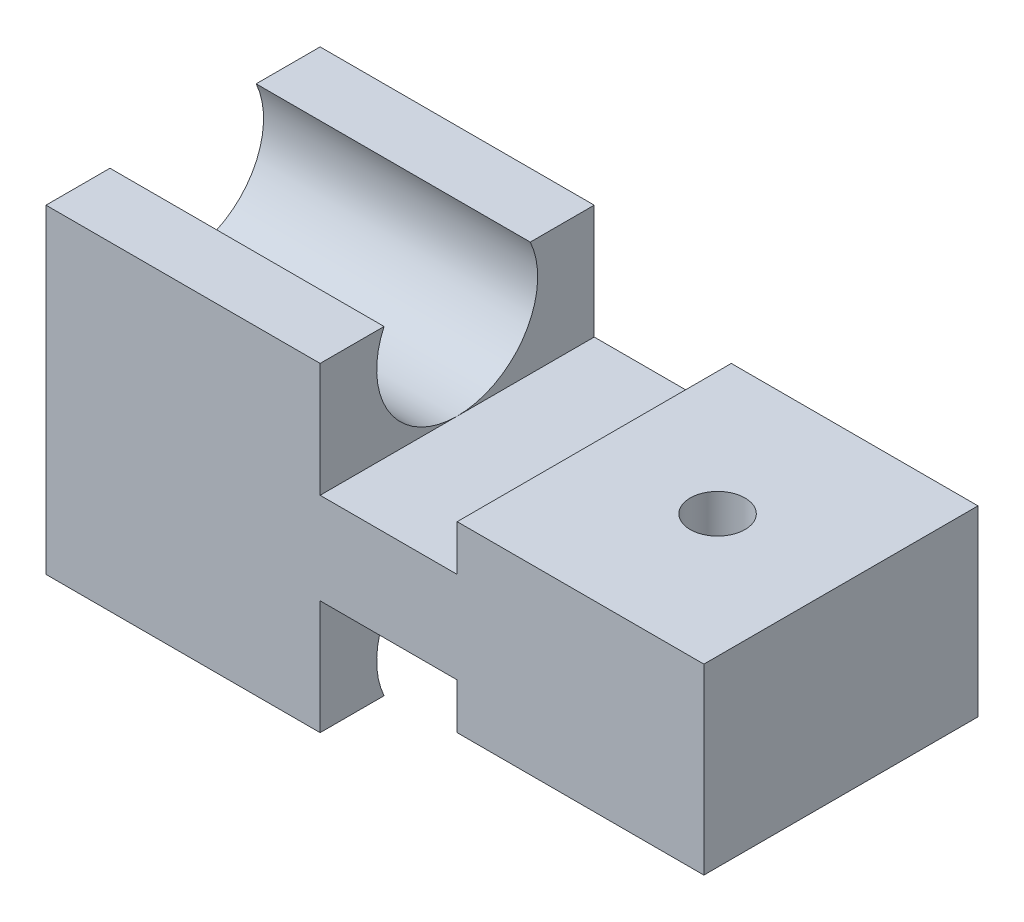
ISO-10303-21;
HEADER;
FILE_DESCRIPTION(('STEP AP214'),'2;1');
FILE_NAME('part.step','',(''),(''),'','','');
FILE_SCHEMA(('AUTOMOTIVE_DESIGN { 1 0 10303 214 1 1 1 1 }'));
ENDSEC;
DATA;
#1=APPLICATION_CONTEXT('core data for automotive mechanical design processes');
#2=APPLICATION_PROTOCOL_DEFINITION('international standard','automotive_design',2000,#1);
#3=PRODUCT_CONTEXT('',#1,'mechanical');
#4=PRODUCT('Part','Part','',(#3));
#5=PRODUCT_RELATED_PRODUCT_CATEGORY('part','',(#4));
#6=PRODUCT_DEFINITION_FORMATION('','',#4);
#7=PRODUCT_DEFINITION_CONTEXT('part definition',#1,'design');
#8=PRODUCT_DEFINITION('design','',#6,#7);
#9=PRODUCT_DEFINITION_SHAPE('','',#8);
#10=(LENGTH_UNIT() NAMED_UNIT(*) SI_UNIT(.MILLI.,.METRE.));
#11=(NAMED_UNIT(*) PLANE_ANGLE_UNIT() SI_UNIT($,.RADIAN.));
#12=(NAMED_UNIT(*) SI_UNIT($,.STERADIAN.) SOLID_ANGLE_UNIT());
#13=UNCERTAINTY_MEASURE_WITH_UNIT(LENGTH_MEASURE(1.E-05),#10,'distance_accuracy_value','');
#14=(GEOMETRIC_REPRESENTATION_CONTEXT(3) GLOBAL_UNCERTAINTY_ASSIGNED_CONTEXT((#13)) GLOBAL_UNIT_ASSIGNED_CONTEXT((#10,
#11,#12)) REPRESENTATION_CONTEXT('',''));
#15=CARTESIAN_POINT('',(0.,0.,0.));
#16=DIRECTION('',(0.,0.,1.));
#17=DIRECTION('',(1.,0.,0.));
#18=AXIS2_PLACEMENT_3D('',#15,#16,#17);
#19=CARTESIAN_POINT('',(15.,0.,30.));
#20=DIRECTION('',(-1.,0.,0.));
#21=DIRECTION('',(0.,0.,1.));
#22=AXIS2_PLACEMENT_3D('',#19,#20,#21);
#23=PLANE('',#22);
#24=DIRECTION('',(0.,0.,-1.));
#25=VECTOR('',#24,1.);
#26=CARTESIAN_POINT('',(15.,17.5,30.));
#27=LINE('',#26,#25);
#28=CARTESIAN_POINT('',(15.,17.5,7.));
#29=VERTEX_POINT('',#28);
#30=CARTESIAN_POINT('',(15.,17.5,0.));
#31=VERTEX_POINT('',#30);
#32=EDGE_CURVE('E235',#29,#31,#27,.T.);
#33=ORIENTED_EDGE('',*,*,#32,.F.);
#34=CARTESIAN_POINT('',(15.,13.81,15.));
#35=DIRECTION('',(-1.,0.,0.));
#36=DIRECTION('',(0.,0.,1.));
#37=AXIS2_PLACEMENT_3D('',#34,#35,#36);
#38=CIRCLE('',#37,8.81);
#39=CARTESIAN_POINT('',(15.,5.,15.));
#40=VERTEX_POINT('',#39);
#41=EDGE_CURVE('E377',#29,#40,#38,.T.);
#42=ORIENTED_EDGE('',*,*,#41,.T.);
#43=DIRECTION('',(0.,0.,-1.));
#44=VECTOR('',#43,1.);
#45=CARTESIAN_POINT('',(15.,5.,30.));
#46=LINE('',#45,#44);
#47=CARTESIAN_POINT('',(15.,5.,0.));
#48=VERTEX_POINT('',#47);
#49=EDGE_CURVE('E89',#40,#48,#46,.T.);
#50=ORIENTED_EDGE('',*,*,#49,.T.);
#51=DIRECTION('',(0.,1.,0.));
#52=VECTOR('',#51,1.);
#53=CARTESIAN_POINT('',(15.,0.,0.));
#54=LINE('',#53,#52);
#55=EDGE_CURVE('E254',#48,#31,#54,.T.);
#56=ORIENTED_EDGE('',*,*,#55,.T.);
#57=EDGE_LOOP('',(#33,#42,#50,#56));
#58=FACE_BOUND('',#57,.T.);
#59=ADVANCED_FACE('F81',(#58),#23,.F.);
#60=CARTESIAN_POINT('',(0.,17.5,30.));
#61=DIRECTION('',(0.,1.,0.));
#62=DIRECTION('',(0.,0.,1.));
#63=AXIS2_PLACEMENT_3D('',#60,#61,#62);
#64=PLANE('',#63);
#65=DIRECTION('',(-1.,0.,0.));
#66=VECTOR('',#65,1.);
#67=CARTESIAN_POINT('',(15.,17.5,7.));
#68=LINE('',#67,#66);
#69=CARTESIAN_POINT('',(-15.,17.5,7.));
#70=VERTEX_POINT('',#69);
#71=EDGE_CURVE('E96',#29,#70,#68,.T.);
#72=ORIENTED_EDGE('',*,*,#71,.F.);
#73=ORIENTED_EDGE('',*,*,#32,.T.);
#74=DIRECTION('',(1.,0.,0.));
#75=VECTOR('',#74,1.);
#76=CARTESIAN_POINT('',(0.,17.5,0.));
#77=LINE('',#76,#75);
#78=CARTESIAN_POINT('',(-15.,17.5,0.));
#79=VERTEX_POINT('',#78);
#80=EDGE_CURVE('E249',#79,#31,#77,.T.);
#81=ORIENTED_EDGE('',*,*,#80,.F.);
#82=DIRECTION('',(0.,0.,-1.));
#83=VECTOR('',#82,1.);
#84=CARTESIAN_POINT('',(-15.,17.5,30.));
#85=LINE('',#84,#83);
#86=EDGE_CURVE('E232',#70,#79,#85,.T.);
#87=ORIENTED_EDGE('',*,*,#86,.F.);
#88=EDGE_LOOP('',(#72,#73,#81,#87));
#89=FACE_BOUND('',#88,.T.);
#90=ADVANCED_FACE('F246',(#89),#64,.T.);
#91=CARTESIAN_POINT('',(0.,-17.5,30.));
#92=DIRECTION('',(0.,1.,0.));
#93=DIRECTION('',(-1.,0.,0.));
#94=AXIS2_PLACEMENT_3D('',#91,#92,#93);
#95=PLANE('',#94);
#96=DIRECTION('',(0.,0.,-1.));
#97=VECTOR('',#96,1.);
#98=CARTESIAN_POINT('',(15.,-17.5,30.));
#99=LINE('',#98,#97);
#100=CARTESIAN_POINT('',(15.,-17.5,7.));
#101=VERTEX_POINT('',#100);
#102=CARTESIAN_POINT('',(15.,-17.5,0.));
#103=VERTEX_POINT('',#102);
#104=EDGE_CURVE('E212',#101,#103,#99,.T.);
#105=ORIENTED_EDGE('',*,*,#104,.F.);
#106=DIRECTION('',(-1.,0.,0.));
#107=VECTOR('',#106,1.);
#108=CARTESIAN_POINT('',(15.,-17.5,7.));
#109=LINE('',#108,#107);
#110=CARTESIAN_POINT('',(-15.,-17.5,7.));
#111=VERTEX_POINT('',#110);
#112=EDGE_CURVE('E198',#101,#111,#109,.T.);
#113=ORIENTED_EDGE('',*,*,#112,.T.);
#114=DIRECTION('',(0.,0.,-1.));
#115=VECTOR('',#114,1.);
#116=CARTESIAN_POINT('',(-15.,-17.5,30.));
#117=LINE('',#116,#115);
#118=CARTESIAN_POINT('',(-15.,-17.5,0.));
#119=VERTEX_POINT('',#118);
#120=EDGE_CURVE('E225',#111,#119,#117,.T.);
#121=ORIENTED_EDGE('',*,*,#120,.T.);
#122=DIRECTION('',(1.,0.,0.));
#123=VECTOR('',#122,1.);
#124=CARTESIAN_POINT('',(0.,-17.5,0.));
#125=LINE('',#124,#123);
#126=EDGE_CURVE('E219',#119,#103,#125,.T.);
#127=ORIENTED_EDGE('',*,*,#126,.T.);
#128=EDGE_LOOP('',(#105,#113,#121,#127));
#129=FACE_BOUND('',#128,.T.);
#130=ADVANCED_FACE('F217',(#129),#95,.F.);
#131=DIRECTION('',(0.,0.,-1.));
#132=VECTOR('',#131,1.);
#133=CARTESIAN_POINT('',(15.,-5.,30.));
#134=LINE('',#133,#132);
#135=CARTESIAN_POINT('',(15.,-5.,15.));
#136=VERTEX_POINT('',#135);
#137=CARTESIAN_POINT('',(15.,-5.,0.));
#138=VERTEX_POINT('',#137);
#139=EDGE_CURVE('E214',#136,#138,#134,.T.);
#140=ORIENTED_EDGE('',*,*,#139,.F.);
#141=CARTESIAN_POINT('',(15.,-13.81,15.));
#142=DIRECTION('',(-1.,0.,0.));
#143=DIRECTION('',(0.,0.,-1.));
#144=AXIS2_PLACEMENT_3D('',#141,#142,#143);
#145=CIRCLE('',#144,8.81);
#146=EDGE_CURVE('E104',#136,#101,#145,.T.);
#147=ORIENTED_EDGE('',*,*,#146,.T.);
#148=ORIENTED_EDGE('',*,*,#104,.T.);
#149=EDGE_CURVE('E261',#103,#138,#54,.T.);
#150=ORIENTED_EDGE('',*,*,#149,.T.);
#151=EDGE_LOOP('',(#140,#147,#148,#150));
#152=FACE_BOUND('',#151,.T.);
#153=ADVANCED_FACE('F210',(#152),#23,.F.);
#154=CARTESIAN_POINT('',(15.,5.,30.));
#155=VERTEX_POINT('',#154);
#156=EDGE_CURVE('E12',#155,#40,#46,.T.);
#157=ORIENTED_EDGE('',*,*,#156,.T.);
#158=CARTESIAN_POINT('',(15.,17.5,23.));
#159=VERTEX_POINT('',#158);
#160=EDGE_CURVE('E374',#40,#159,#38,.T.);
#161=ORIENTED_EDGE('',*,*,#160,.T.);
#162=CARTESIAN_POINT('',(15.,17.5,30.));
#163=VERTEX_POINT('',#162);
#164=EDGE_CURVE('E236',#163,#159,#27,.T.);
#165=ORIENTED_EDGE('',*,*,#164,.F.);
#166=DIRECTION('',(0.,1.,0.));
#167=VECTOR('',#166,1.);
#168=CARTESIAN_POINT('',(15.,0.,30.));
#169=LINE('',#168,#167);
#170=EDGE_CURVE('E352',#155,#163,#169,.T.);
#171=ORIENTED_EDGE('',*,*,#170,.F.);
#172=EDGE_LOOP('',(#157,#161,#165,#171));
#173=FACE_BOUND('',#172,.T.);
#174=ADVANCED_FACE('F408',(#173),#23,.F.);
#175=DIRECTION('',(-1.,0.,0.));
#176=VECTOR('',#175,1.);
#177=CARTESIAN_POINT('',(15.,17.5,23.));
#178=LINE('',#177,#176);
#179=CARTESIAN_POINT('',(-15.,17.5,23.));
#180=VERTEX_POINT('',#179);
#181=EDGE_CURVE('E372',#159,#180,#178,.T.);
#182=ORIENTED_EDGE('',*,*,#181,.T.);
#183=CARTESIAN_POINT('',(-15.,17.5,30.));
#184=VERTEX_POINT('',#183);
#185=EDGE_CURVE('E233',#184,#180,#85,.T.);
#186=ORIENTED_EDGE('',*,*,#185,.F.);
#187=DIRECTION('',(1.,0.,0.));
#188=VECTOR('',#187,1.);
#189=CARTESIAN_POINT('',(0.,17.5,30.));
#190=LINE('',#189,#188);
#191=EDGE_CURVE('E354',#184,#163,#190,.T.);
#192=ORIENTED_EDGE('',*,*,#191,.T.);
#193=ORIENTED_EDGE('',*,*,#164,.T.);
#194=EDGE_LOOP('',(#182,#186,#192,#193));
#195=FACE_BOUND('',#194,.T.);
#196=ADVANCED_FACE('F404',(#195),#64,.T.);
#197=CARTESIAN_POINT('',(-15.,0.,30.));
#198=DIRECTION('',(-1.,0.,0.));
#199=DIRECTION('',(0.,0.,1.));
#200=AXIS2_PLACEMENT_3D('',#197,#198,#199);
#201=PLANE('',#200);
#202=CARTESIAN_POINT('',(-15.,-13.81,15.));
#203=DIRECTION('',(-1.,0.,0.));
#204=DIRECTION('',(0.,0.,-1.));
#205=AXIS2_PLACEMENT_3D('',#202,#203,#204);
#206=CIRCLE('',#205,8.81);
#207=CARTESIAN_POINT('',(-15.,-17.5,23.));
#208=VERTEX_POINT('',#207);
#209=EDGE_CURVE('E201',#208,#111,#206,.T.);
#210=ORIENTED_EDGE('',*,*,#209,.F.);
#211=CARTESIAN_POINT('',(-15.,-17.5,30.));
#212=VERTEX_POINT('',#211);
#213=EDGE_CURVE('E229',#212,#208,#117,.T.);
#214=ORIENTED_EDGE('',*,*,#213,.F.);
#215=DIRECTION('',(0.,1.,0.));
#216=VECTOR('',#215,1.);
#217=CARTESIAN_POINT('',(-15.,0.,30.));
#218=LINE('',#217,#216);
#219=EDGE_CURVE('E356',#212,#184,#218,.T.);
#220=ORIENTED_EDGE('',*,*,#219,.T.);
#221=ORIENTED_EDGE('',*,*,#185,.T.);
#222=CARTESIAN_POINT('',(-15.,13.81,15.));
#223=DIRECTION('',(-1.,0.,0.));
#224=DIRECTION('',(0.,0.,1.));
#225=AXIS2_PLACEMENT_3D('',#222,#223,#224);
#226=CIRCLE('',#225,8.81);
#227=EDGE_CURVE('E369',#70,#180,#226,.T.);
#228=ORIENTED_EDGE('',*,*,#227,.F.);
#229=ORIENTED_EDGE('',*,*,#86,.T.);
#230=DIRECTION('',(0.,1.,0.));
#231=VECTOR('',#230,1.);
#232=CARTESIAN_POINT('',(-15.,0.,0.));
#233=LINE('',#232,#231);
#234=EDGE_CURVE('E264',#119,#79,#233,.T.);
#235=ORIENTED_EDGE('',*,*,#234,.F.);
#236=ORIENTED_EDGE('',*,*,#120,.F.);
#237=EDGE_LOOP('',(#210,#214,#220,#221,#228,#229,#235,#236));
#238=FACE_BOUND('',#237,.T.);
#239=ADVANCED_FACE('F415',(#238),#201,.T.);
#240=ORIENTED_EDGE('',*,*,#213,.T.);
#241=DIRECTION('',(-1.,0.,0.));
#242=VECTOR('',#241,1.);
#243=CARTESIAN_POINT('',(15.,-17.5,23.));
#244=LINE('',#243,#242);
#245=CARTESIAN_POINT('',(15.,-17.5,23.));
#246=VERTEX_POINT('',#245);
#247=EDGE_CURVE('E205',#246,#208,#244,.T.);
#248=ORIENTED_EDGE('',*,*,#247,.F.);
#249=CARTESIAN_POINT('',(15.,-17.5,30.));
#250=VERTEX_POINT('',#249);
#251=EDGE_CURVE('E221',#250,#246,#99,.T.);
#252=ORIENTED_EDGE('',*,*,#251,.F.);
#253=DIRECTION('',(1.,0.,0.));
#254=VECTOR('',#253,1.);
#255=CARTESIAN_POINT('',(0.,-17.5,30.));
#256=LINE('',#255,#254);
#257=EDGE_CURVE('E359',#212,#250,#256,.T.);
#258=ORIENTED_EDGE('',*,*,#257,.F.);
#259=EDGE_LOOP('',(#240,#248,#252,#258));
#260=FACE_BOUND('',#259,.T.);
#261=ADVANCED_FACE('F410',(#260),#95,.F.);
#262=ORIENTED_EDGE('',*,*,#251,.T.);
#263=EDGE_CURVE('E206',#246,#136,#145,.T.);
#264=ORIENTED_EDGE('',*,*,#263,.T.);
#265=CARTESIAN_POINT('',(15.,-5.,30.));
#266=VERTEX_POINT('',#265);
#267=EDGE_CURVE('E222',#266,#136,#134,.T.);
#268=ORIENTED_EDGE('',*,*,#267,.F.);
#269=EDGE_CURVE('E324',#250,#266,#169,.T.);
#270=ORIENTED_EDGE('',*,*,#269,.F.);
#271=EDGE_LOOP('',(#262,#264,#268,#270));
#272=FACE_BOUND('',#271,.T.);
#273=ADVANCED_FACE('F365',(#272),#23,.F.);
#274=CARTESIAN_POINT('',(0.,-5.,30.));
#275=DIRECTION('',(0.,1.,0.));
#276=DIRECTION('',(0.,0.,1.));
#277=AXIS2_PLACEMENT_3D('',#274,#275,#276);
#278=PLANE('',#277);
#279=DIRECTION('',(1.,0.,0.));
#280=VECTOR('',#279,1.);
#281=CARTESIAN_POINT('',(0.,-5.,0.));
#282=LINE('',#281,#280);
#283=CARTESIAN_POINT('',(30.,-5.,0.));
#284=VERTEX_POINT('',#283);
#285=EDGE_CURVE('E270',#138,#284,#282,.T.);
#286=ORIENTED_EDGE('',*,*,#285,.T.);
#287=DIRECTION('',(0.,0.,-1.));
#288=VECTOR('',#287,1.);
#289=CARTESIAN_POINT('',(30.,-5.,30.));
#290=LINE('',#289,#288);
#291=CARTESIAN_POINT('',(30.,-5.,30.));
#292=VERTEX_POINT('',#291);
#293=EDGE_CURVE('E296',#292,#284,#290,.T.);
#294=ORIENTED_EDGE('',*,*,#293,.F.);
#295=DIRECTION('',(1.,0.,0.));
#296=VECTOR('',#295,1.);
#297=CARTESIAN_POINT('',(0.,-5.,30.));
#298=LINE('',#297,#296);
#299=EDGE_CURVE('E322',#266,#292,#298,.T.);
#300=ORIENTED_EDGE('',*,*,#299,.F.);
#301=ORIENTED_EDGE('',*,*,#267,.T.);
#302=ORIENTED_EDGE('',*,*,#139,.T.);
#303=EDGE_LOOP('',(#286,#294,#300,#301,#302));
#304=FACE_BOUND('',#303,.T.);
#305=ADVANCED_FACE('F302',(#304),#278,.F.);
#306=CARTESIAN_POINT('',(30.,0.,30.));
#307=DIRECTION('',(-1.,0.,0.));
#308=DIRECTION('',(0.,0.,1.));
#309=AXIS2_PLACEMENT_3D('',#306,#307,#308);
#310=PLANE('',#309);
#311=DIRECTION('',(0.,1.,0.));
#312=VECTOR('',#311,1.);
#313=CARTESIAN_POINT('',(30.,0.,0.));
#314=LINE('',#313,#312);
#315=CARTESIAN_POINT('',(30.,-10.,0.));
#316=VERTEX_POINT('',#315);
#317=EDGE_CURVE('E273',#316,#284,#314,.T.);
#318=ORIENTED_EDGE('',*,*,#317,.F.);
#319=DIRECTION('',(0.,0.,-1.));
#320=VECTOR('',#319,1.);
#321=CARTESIAN_POINT('',(30.,-10.,30.));
#322=LINE('',#321,#320);
#323=CARTESIAN_POINT('',(30.,-10.,30.));
#324=VERTEX_POINT('',#323);
#325=EDGE_CURVE('E295',#324,#316,#322,.T.);
#326=ORIENTED_EDGE('',*,*,#325,.F.);
#327=DIRECTION('',(0.,1.,0.));
#328=VECTOR('',#327,1.);
#329=CARTESIAN_POINT('',(30.,0.,30.));
#330=LINE('',#329,#328);
#331=EDGE_CURVE('E311',#324,#292,#330,.T.);
#332=ORIENTED_EDGE('',*,*,#331,.T.);
#333=ORIENTED_EDGE('',*,*,#293,.T.);
#334=EDGE_LOOP('',(#318,#326,#332,#333));
#335=FACE_BOUND('',#334,.T.);
#336=ADVANCED_FACE('F308',(#335),#310,.T.);
#337=CARTESIAN_POINT('',(0.,-10.,30.));
#338=DIRECTION('',(0.,1.,0.));
#339=DIRECTION('',(0.,0.,1.));
#340=AXIS2_PLACEMENT_3D('',#337,#338,#339);
#341=PLANE('',#340);
#342=CARTESIAN_POINT('',(43.5,-10.,15.));
#343=DIRECTION('',(0.,1.,0.));
#344=DIRECTION('',(0.,0.,1.));
#345=AXIS2_PLACEMENT_3D('',#342,#343,#344);
#346=CIRCLE('',#345,3.);
#347=CARTESIAN_POINT('',(43.5,-10.,18.));
#348=VERTEX_POINT('',#347);
#349=EDGE_CURVE('E344',#348,#348,#346,.T.);
#350=ORIENTED_EDGE('',*,*,#349,.T.);
#351=EDGE_LOOP('',(#350));
#352=FACE_BOUND('',#351,.T.);
#353=DIRECTION('',(1.,0.,0.));
#354=VECTOR('',#353,1.);
#355=CARTESIAN_POINT('',(0.,-10.,0.));
#356=LINE('',#355,#354);
#357=CARTESIAN_POINT('',(57.,-10.,0.));
#358=VERTEX_POINT('',#357);
#359=EDGE_CURVE('E276',#316,#358,#356,.T.);
#360=ORIENTED_EDGE('',*,*,#359,.T.);
#361=DIRECTION('',(0.,0.,-1.));
#362=VECTOR('',#361,1.);
#363=CARTESIAN_POINT('',(57.,-10.,30.));
#364=LINE('',#363,#362);
#365=CARTESIAN_POINT('',(57.,-10.,30.));
#366=VERTEX_POINT('',#365);
#367=EDGE_CURVE('E292',#366,#358,#364,.T.);
#368=ORIENTED_EDGE('',*,*,#367,.F.);
#369=DIRECTION('',(1.,0.,0.));
#370=VECTOR('',#369,1.);
#371=CARTESIAN_POINT('',(0.,-10.,30.));
#372=LINE('',#371,#370);
#373=EDGE_CURVE('E314',#324,#366,#372,.T.);
#374=ORIENTED_EDGE('',*,*,#373,.F.);
#375=ORIENTED_EDGE('',*,*,#325,.T.);
#376=EDGE_LOOP('',(#360,#368,#374,#375));
#377=FACE_BOUND('',#376,.T.);
#378=ADVANCED_FACE('F315',(#352,#377),#341,.F.);
#379=CARTESIAN_POINT('',(57.,0.,30.));
#380=DIRECTION('',(-1.,0.,0.));
#381=DIRECTION('',(0.,-1.,0.));
#382=AXIS2_PLACEMENT_3D('',#379,#380,#381);
#383=PLANE('',#382);
#384=DIRECTION('',(0.,1.,0.));
#385=VECTOR('',#384,1.);
#386=CARTESIAN_POINT('',(57.,0.,0.));
#387=LINE('',#386,#385);
#388=CARTESIAN_POINT('',(57.,9.99999999999999,0.));
#389=VERTEX_POINT('',#388);
#390=EDGE_CURVE('E279',#358,#389,#387,.T.);
#391=ORIENTED_EDGE('',*,*,#390,.T.);
#392=DIRECTION('',(0.,0.,-1.));
#393=VECTOR('',#392,1.);
#394=CARTESIAN_POINT('',(57.,9.99999999999999,30.));
#395=LINE('',#394,#393);
#396=CARTESIAN_POINT('',(57.,9.99999999999999,30.));
#397=VERTEX_POINT('',#396);
#398=EDGE_CURVE('E290',#397,#389,#395,.T.);
#399=ORIENTED_EDGE('',*,*,#398,.F.);
#400=DIRECTION('',(0.,1.,0.));
#401=VECTOR('',#400,1.);
#402=CARTESIAN_POINT('',(57.,0.,30.));
#403=LINE('',#402,#401);
#404=EDGE_CURVE('E318',#366,#397,#403,.T.);
#405=ORIENTED_EDGE('',*,*,#404,.F.);
#406=ORIENTED_EDGE('',*,*,#367,.T.);
#407=EDGE_LOOP('',(#391,#399,#405,#406));
#408=FACE_BOUND('',#407,.T.);
#409=ADVANCED_FACE('F430',(#408),#383,.F.);
#410=CARTESIAN_POINT('',(0.,9.99999999999999,30.));
#411=DIRECTION('',(0.,1.,0.));
#412=DIRECTION('',(0.,0.,1.));
#413=AXIS2_PLACEMENT_3D('',#410,#411,#412);
#414=PLANE('',#413);
#415=CARTESIAN_POINT('',(43.5,9.99999999999999,15.));
#416=DIRECTION('',(0.,1.,0.));
#417=DIRECTION('',(0.,0.,1.));
#418=AXIS2_PLACEMENT_3D('',#415,#416,#417);
#419=CIRCLE('',#418,3.);
#420=CARTESIAN_POINT('',(43.5,9.99999999999999,18.));
#421=VERTEX_POINT('',#420);
#422=EDGE_CURVE('E370',#421,#421,#419,.T.);
#423=ORIENTED_EDGE('',*,*,#422,.F.);
#424=EDGE_LOOP('',(#423));
#425=FACE_BOUND('',#424,.T.);
#426=DIRECTION('',(1.,0.,0.));
#427=VECTOR('',#426,1.);
#428=CARTESIAN_POINT('',(0.,9.99999999999999,0.));
#429=LINE('',#428,#427);
#430=CARTESIAN_POINT('',(30.,9.99999999999999,0.));
#431=VERTEX_POINT('',#430);
#432=EDGE_CURVE('E282',#431,#389,#429,.T.);
#433=ORIENTED_EDGE('',*,*,#432,.F.);
#434=DIRECTION('',(0.,0.,-1.));
#435=VECTOR('',#434,1.);
#436=CARTESIAN_POINT('',(30.,9.99999999999999,30.));
#437=LINE('',#436,#435);
#438=CARTESIAN_POINT('',(30.,9.99999999999999,30.));
#439=VERTEX_POINT('',#438);
#440=EDGE_CURVE('E287',#439,#431,#437,.T.);
#441=ORIENTED_EDGE('',*,*,#440,.F.);
#442=DIRECTION('',(1.,0.,0.));
#443=VECTOR('',#442,1.);
#444=CARTESIAN_POINT('',(0.,9.99999999999999,30.));
#445=LINE('',#444,#443);
#446=EDGE_CURVE('E327',#439,#397,#445,.T.);
#447=ORIENTED_EDGE('',*,*,#446,.T.);
#448=ORIENTED_EDGE('',*,*,#398,.T.);
#449=EDGE_LOOP('',(#433,#441,#447,#448));
#450=FACE_BOUND('',#449,.T.);
#451=ADVANCED_FACE('F427',(#425,#450),#414,.T.);
#452=CARTESIAN_POINT('',(30.,5.,0.));
#453=VERTEX_POINT('',#452);
#454=EDGE_CURVE('E277',#453,#431,#314,.T.);
#455=ORIENTED_EDGE('',*,*,#454,.F.);
#456=DIRECTION('',(0.,0.,-1.));
#457=VECTOR('',#456,1.);
#458=CARTESIAN_POINT('',(30.,5.,30.));
#459=LINE('',#458,#457);
#460=CARTESIAN_POINT('',(30.,5.,30.));
#461=VERTEX_POINT('',#460);
#462=EDGE_CURVE('E285',#461,#453,#459,.T.);
#463=ORIENTED_EDGE('',*,*,#462,.F.);
#464=EDGE_CURVE('E288',#461,#439,#330,.T.);
#465=ORIENTED_EDGE('',*,*,#464,.T.);
#466=ORIENTED_EDGE('',*,*,#440,.T.);
#467=EDGE_LOOP('',(#455,#463,#465,#466));
#468=FACE_BOUND('',#467,.T.);
#469=ADVANCED_FACE('F425',(#468),#310,.T.);
#470=CARTESIAN_POINT('',(0.,5.,30.));
#471=DIRECTION('',(0.,1.,0.));
#472=DIRECTION('',(0.,0.,1.));
#473=AXIS2_PLACEMENT_3D('',#470,#471,#472);
#474=PLANE('',#473);
#475=DIRECTION('',(1.,0.,0.));
#476=VECTOR('',#475,1.);
#477=CARTESIAN_POINT('',(0.,5.,0.));
#478=LINE('',#477,#476);
#479=EDGE_CURVE('E259',#48,#453,#478,.T.);
#480=ORIENTED_EDGE('',*,*,#479,.F.);
#481=ORIENTED_EDGE('',*,*,#49,.F.);
#482=ORIENTED_EDGE('',*,*,#156,.F.);
#483=DIRECTION('',(1.,0.,0.));
#484=VECTOR('',#483,1.);
#485=CARTESIAN_POINT('',(0.,5.,30.));
#486=LINE('',#485,#484);
#487=EDGE_CURVE('E349',#155,#461,#486,.T.);
#488=ORIENTED_EDGE('',*,*,#487,.T.);
#489=ORIENTED_EDGE('',*,*,#462,.T.);
#490=EDGE_LOOP('',(#480,#481,#482,#488,#489));
#491=FACE_BOUND('',#490,.T.);
#492=ADVANCED_FACE('F83',(#491),#474,.T.);
#493=CARTESIAN_POINT('',(0.,0.,0.));
#494=DIRECTION('',(0.,0.,1.));
#495=DIRECTION('',(1.,0.,0.));
#496=AXIS2_PLACEMENT_3D('',#493,#494,#495);
#497=PLANE('',#496);
#498=CARTESIAN_POINT('',(15.,0.,0.));
#499=DIRECTION('',(0.,0.,1.));
#500=DIRECTION('',(1.,0.,0.));
#501=AXIS2_PLACEMENT_3D('',#498,#499,#500);
#502=CIRCLE('',#501,1.5);
#503=CARTESIAN_POINT('',(16.5,0.,0.));
#504=VERTEX_POINT('',#503);
#505=EDGE_CURVE('E339',#504,#504,#502,.T.);
#506=ORIENTED_EDGE('',*,*,#505,.T.);
#507=EDGE_LOOP('',(#506));
#508=FACE_BOUND('',#507,.T.);
#509=ORIENTED_EDGE('',*,*,#479,.T.);
#510=ORIENTED_EDGE('',*,*,#454,.T.);
#511=ORIENTED_EDGE('',*,*,#432,.T.);
#512=ORIENTED_EDGE('',*,*,#390,.F.);
#513=ORIENTED_EDGE('',*,*,#359,.F.);
#514=ORIENTED_EDGE('',*,*,#317,.T.);
#515=ORIENTED_EDGE('',*,*,#285,.F.);
#516=ORIENTED_EDGE('',*,*,#149,.F.);
#517=ORIENTED_EDGE('',*,*,#126,.F.);
#518=ORIENTED_EDGE('',*,*,#234,.T.);
#519=ORIENTED_EDGE('',*,*,#80,.T.);
#520=ORIENTED_EDGE('',*,*,#55,.F.);
#521=EDGE_LOOP('',(#509,#510,#511,#512,#513,#514,#515,#516,#517,#518,#519,#520));
#522=FACE_BOUND('',#521,.T.);
#523=ADVANCED_FACE('F262',(#508,#522),#497,.F.);
#524=CARTESIAN_POINT('',(0.,0.,30.));
#525=DIRECTION('',(0.,0.,1.));
#526=DIRECTION('',(1.,0.,0.));
#527=AXIS2_PLACEMENT_3D('',#524,#525,#526);
#528=PLANE('',#527);
#529=ORIENTED_EDGE('',*,*,#487,.F.);
#530=ORIENTED_EDGE('',*,*,#170,.T.);
#531=ORIENTED_EDGE('',*,*,#191,.F.);
#532=ORIENTED_EDGE('',*,*,#219,.F.);
#533=ORIENTED_EDGE('',*,*,#257,.T.);
#534=ORIENTED_EDGE('',*,*,#269,.T.);
#535=ORIENTED_EDGE('',*,*,#299,.T.);
#536=ORIENTED_EDGE('',*,*,#331,.F.);
#537=ORIENTED_EDGE('',*,*,#373,.T.);
#538=ORIENTED_EDGE('',*,*,#404,.T.);
#539=ORIENTED_EDGE('',*,*,#446,.F.);
#540=ORIENTED_EDGE('',*,*,#464,.F.);
#541=EDGE_LOOP('',(#529,#530,#531,#532,#533,#534,#535,#536,#537,#538,#539,#540));
#542=FACE_BOUND('',#541,.T.);
#543=ADVANCED_FACE('F321',(#542),#528,.T.);
#544=CARTESIAN_POINT('',(15.,0.,8.));
#545=DIRECTION('',(0.,0.,-1.));
#546=DIRECTION('',(-1.,0.,0.));
#547=AXIS2_PLACEMENT_3D('',#544,#545,#546);
#548=CYLINDRICAL_SURFACE('',#547,1.5);
#549=CARTESIAN_POINT('',(15.,0.,8.));
#550=DIRECTION('',(0.,0.,1.));
#551=DIRECTION('',(1.,0.,0.));
#552=AXIS2_PLACEMENT_3D('',#549,#550,#551);
#553=CIRCLE('',#552,1.5);
#554=CARTESIAN_POINT('',(16.5,0.,8.));
#555=VERTEX_POINT('',#554);
#556=EDGE_CURVE('E335',#555,#555,#553,.T.);
#557=ORIENTED_EDGE('',*,*,#556,.T.);
#558=EDGE_LOOP('',(#557));
#559=FACE_BOUND('',#558,.T.);
#560=ORIENTED_EDGE('',*,*,#505,.F.);
#561=EDGE_LOOP('',(#560));
#562=FACE_BOUND('',#561,.T.);
#563=ADVANCED_FACE('F395',(#559,#562),#548,.F.);
#564=CARTESIAN_POINT('',(0.,0.,8.));
#565=DIRECTION('',(0.,0.,1.));
#566=DIRECTION('',(1.,0.,0.));
#567=AXIS2_PLACEMENT_3D('',#564,#565,#566);
#568=PLANE('',#567);
#569=ORIENTED_EDGE('',*,*,#556,.F.);
#570=EDGE_LOOP('',(#569));
#571=FACE_BOUND('',#570,.T.);
#572=ADVANCED_FACE('F387',(#571),#568,.F.);
#573=CARTESIAN_POINT('',(43.5,-17.5,15.));
#574=DIRECTION('',(0.,1.,0.));
#575=DIRECTION('',(0.,0.,1.));
#576=AXIS2_PLACEMENT_3D('',#573,#574,#575);
#577=CYLINDRICAL_SURFACE('',#576,3.);
#578=ORIENTED_EDGE('',*,*,#422,.T.);
#579=EDGE_LOOP('',(#578));
#580=FACE_BOUND('',#579,.T.);
#581=ORIENTED_EDGE('',*,*,#349,.F.);
#582=EDGE_LOOP('',(#581));
#583=FACE_BOUND('',#582,.T.);
#584=ADVANCED_FACE('F385',(#580,#583),#577,.F.);
#585=CARTESIAN_POINT('',(15.,-13.81,15.));
#586=DIRECTION('',(-1.,0.,0.));
#587=DIRECTION('',(0.,0.,1.));
#588=AXIS2_PLACEMENT_3D('',#585,#586,#587);
#589=CYLINDRICAL_SURFACE('',#588,8.81);
#590=ORIENTED_EDGE('',*,*,#209,.T.);
#591=ORIENTED_EDGE('',*,*,#112,.F.);
#592=ORIENTED_EDGE('',*,*,#146,.F.);
#593=ORIENTED_EDGE('',*,*,#263,.F.);
#594=ORIENTED_EDGE('',*,*,#247,.T.);
#595=EDGE_LOOP('',(#590,#591,#592,#593,#594));
#596=FACE_BOUND('',#595,.T.);
#597=ADVANCED_FACE('F199',(#596),#589,.F.);
#598=CARTESIAN_POINT('',(15.,13.81,15.));
#599=DIRECTION('',(-1.,0.,0.));
#600=DIRECTION('',(0.,0.,1.));
#601=AXIS2_PLACEMENT_3D('',#598,#599,#600);
#602=CYLINDRICAL_SURFACE('',#601,8.81);
#603=ORIENTED_EDGE('',*,*,#227,.T.);
#604=ORIENTED_EDGE('',*,*,#181,.F.);
#605=ORIENTED_EDGE('',*,*,#160,.F.);
#606=ORIENTED_EDGE('',*,*,#41,.F.);
#607=ORIENTED_EDGE('',*,*,#71,.T.);
#608=EDGE_LOOP('',(#603,#604,#605,#606,#607));
#609=FACE_BOUND('',#608,.T.);
#610=ADVANCED_FACE('F393',(#609),#602,.F.);
#611=CLOSED_SHELL('',(#59,#90,#130,#153,#174,#196,#239,#261,#273,#305,#336,#378,#409,#451,#469,
#492,#523,#543,#563,#572,#584,#597,#610));
#612=MANIFOLD_SOLID_BREP('B2',#611);
#613=ADVANCED_BREP_SHAPE_REPRESENTATION('',(#18,#612),#14);
#614=SHAPE_DEFINITION_REPRESENTATION(#9,#613);
ENDSEC;
END-ISO-10303-21;
